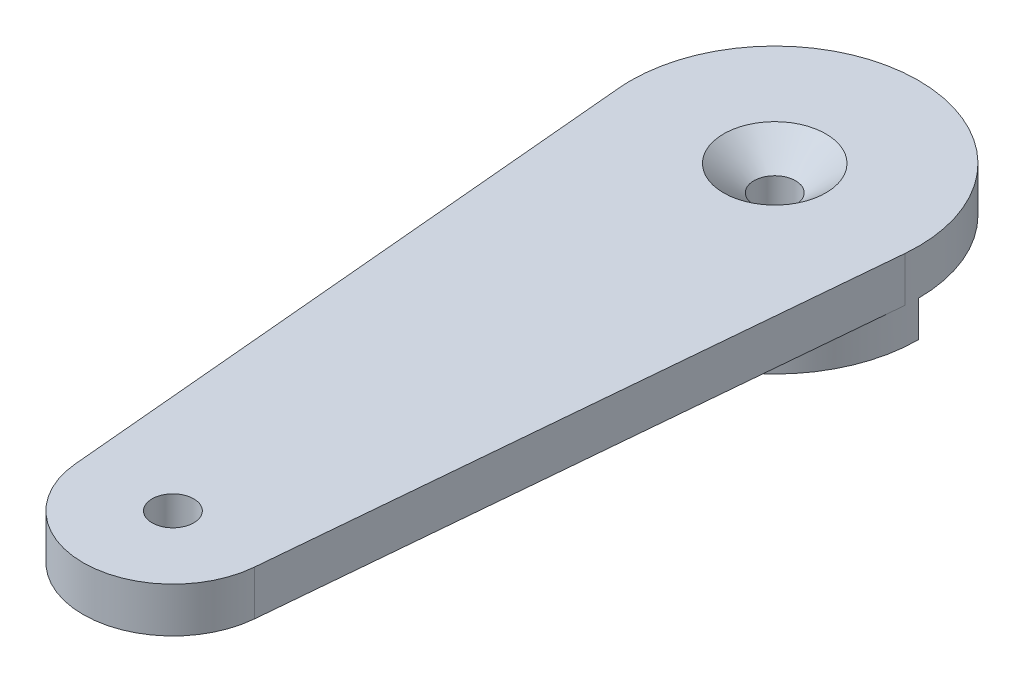
ISO-10303-21;
HEADER;
FILE_DESCRIPTION(('STEP AP214'),'2;1');
FILE_NAME('part.step','',(''),(''),'','','');
FILE_SCHEMA(('AUTOMOTIVE_DESIGN { 1 0 10303 214 1 1 1 1 }'));
ENDSEC;
DATA;
#1=APPLICATION_CONTEXT('core data for automotive mechanical design processes');
#2=APPLICATION_PROTOCOL_DEFINITION('international standard','automotive_design',2000,#1);
#3=PRODUCT_CONTEXT('',#1,'mechanical');
#4=PRODUCT('Part','Part','',(#3));
#5=PRODUCT_RELATED_PRODUCT_CATEGORY('part','',(#4));
#6=PRODUCT_DEFINITION_FORMATION('','',#4);
#7=PRODUCT_DEFINITION_CONTEXT('part definition',#1,'design');
#8=PRODUCT_DEFINITION('design','',#6,#7);
#9=PRODUCT_DEFINITION_SHAPE('','',#8);
#10=(LENGTH_UNIT() NAMED_UNIT(*) SI_UNIT(.MILLI.,.METRE.));
#11=(NAMED_UNIT(*) PLANE_ANGLE_UNIT() SI_UNIT($,.RADIAN.));
#12=(NAMED_UNIT(*) SI_UNIT($,.STERADIAN.) SOLID_ANGLE_UNIT());
#13=UNCERTAINTY_MEASURE_WITH_UNIT(LENGTH_MEASURE(1.E-05),#10,'distance_accuracy_value','');
#14=(GEOMETRIC_REPRESENTATION_CONTEXT(3) GLOBAL_UNCERTAINTY_ASSIGNED_CONTEXT((#13)) GLOBAL_UNIT_ASSIGNED_CONTEXT((#10,
#11,#12)) REPRESENTATION_CONTEXT('',''));
#15=CARTESIAN_POINT('',(0.,0.,0.));
#16=DIRECTION('',(0.,0.,1.));
#17=DIRECTION('',(1.,0.,0.));
#18=AXIS2_PLACEMENT_3D('',#15,#16,#17);
#19=CARTESIAN_POINT('',(0.,3.175,-4.16835077739208E-13));
#20=DIRECTION('',(0.,-1.,0.));
#21=DIRECTION('',(0.,0.,-1.));
#22=AXIS2_PLACEMENT_3D('',#19,#20,#21);
#23=PLANE('',#22);
#24=CARTESIAN_POINT('',(0.,3.175,-4.16835077739208E-13));
#25=DIRECTION('',(0.,1.,0.));
#26=DIRECTION('',(0.,0.,-1.));
#27=AXIS2_PLACEMENT_3D('',#24,#25,#26);
#28=CIRCLE('',#27,10.1600000000001);
#29=CARTESIAN_POINT('',(10.1191784063488,3.175,0.909850746268673));
#30=VERTEX_POINT('',#29);
#31=CARTESIAN_POINT('',(-10.1191784063488,3.175,0.909850746268676));
#32=VERTEX_POINT('',#31);
#33=EDGE_CURVE('E130',#30,#32,#28,.T.);
#34=ORIENTED_EDGE('',*,*,#33,.T.);
#35=DIRECTION('',(0.0895522388059716,0.,0.995982126609127));
#36=VECTOR('',#35,1.);
#37=CARTESIAN_POINT('',(-10.1191784063488,3.175,0.909850746268676));
#38=LINE('',#37,#36);
#39=CARTESIAN_POINT('',(-6.32448650396794,3.175,43.1136567164179));
#40=VERTEX_POINT('',#39);
#41=EDGE_CURVE('E133',#32,#40,#38,.T.);
#42=ORIENTED_EDGE('',*,*,#41,.T.);
#43=CARTESIAN_POINT('',(0.,3.175,42.545));
#44=DIRECTION('',(0.,1.,0.));
#45=DIRECTION('',(0.,0.,1.));
#46=AXIS2_PLACEMENT_3D('',#43,#44,#45);
#47=CIRCLE('',#46,6.35);
#48=CARTESIAN_POINT('',(6.32448650396795,3.175,43.1136567164179));
#49=VERTEX_POINT('',#48);
#50=EDGE_CURVE('E136',#40,#49,#47,.T.);
#51=ORIENTED_EDGE('',*,*,#50,.T.);
#52=DIRECTION('',(0.0895522388059713,0.,-0.995982126609127));
#53=VECTOR('',#52,1.);
#54=CARTESIAN_POINT('',(6.32448650396796,3.175,43.1136567164179));
#55=LINE('',#54,#53);
#56=EDGE_CURVE('E138',#49,#30,#55,.T.);
#57=ORIENTED_EDGE('',*,*,#56,.T.);
#58=EDGE_LOOP('',(#34,#42,#51,#57));
#59=FACE_BOUND('',#58,.T.);
#60=CARTESIAN_POINT('',(0.,3.175,42.545));
#61=DIRECTION('',(0.,1.,0.));
#62=DIRECTION('',(0.,0.,1.));
#63=AXIS2_PLACEMENT_3D('',#60,#61,#62);
#64=CIRCLE('',#63,1.4732);
#65=CARTESIAN_POINT('',(0.,3.175,44.0182));
#66=VERTEX_POINT('',#65);
#67=EDGE_CURVE('E121',#66,#66,#64,.T.);
#68=ORIENTED_EDGE('',*,*,#67,.F.);
#69=EDGE_LOOP('',(#68));
#70=FACE_BOUND('',#69,.T.);
#71=CARTESIAN_POINT('',(0.,3.175,0.));
#72=DIRECTION('',(0.,1.,0.));
#73=DIRECTION('',(0.,0.,1.));
#74=AXIS2_PLACEMENT_3D('',#71,#72,#73);
#75=CIRCLE('',#74,3.6142676);
#76=CARTESIAN_POINT('',(0.,3.175,3.6142676));
#77=VERTEX_POINT('',#76);
#78=EDGE_CURVE('E183',#77,#77,#75,.T.);
#79=ORIENTED_EDGE('',*,*,#78,.F.);
#80=EDGE_LOOP('',(#79));
#81=FACE_BOUND('',#80,.T.);
#82=ADVANCED_FACE('F32',(#59,#70,#81),#23,.F.);
#83=CARTESIAN_POINT('',(0.,0.,-4.16835077739208E-13));
#84=DIRECTION('',(0.,-1.,0.));
#85=DIRECTION('',(0.,0.,-1.));
#86=AXIS2_PLACEMENT_3D('',#83,#84,#85);
#87=PLANE('',#86);
#88=CARTESIAN_POINT('',(0.,0.,-4.52308528141854E-13));
#89=DIRECTION('',(0.,-1.,0.));
#90=DIRECTION('',(0.,0.,-1.));
#91=AXIS2_PLACEMENT_3D('',#88,#89,#90);
#92=CIRCLE('',#91,10.16);
#93=CARTESIAN_POINT('',(10.1191784063488,0.,0.909850746268673));
#94=VERTEX_POINT('',#93);
#95=CARTESIAN_POINT('',(-10.1191784063488,0.,0.909850746268676));
#96=VERTEX_POINT('',#95);
#97=EDGE_CURVE('E11',#94,#96,#92,.T.);
#98=ORIENTED_EDGE('',*,*,#97,.F.);
#99=DIRECTION('',(0.0895522388059713,0.,-0.995982126609127));
#100=VECTOR('',#99,1.);
#101=CARTESIAN_POINT('',(6.32448650396796,0.,43.1136567164179));
#102=LINE('',#101,#100);
#103=CARTESIAN_POINT('',(6.32448650396795,0.,43.1136567164179));
#104=VERTEX_POINT('',#103);
#105=EDGE_CURVE('E134',#104,#94,#102,.T.);
#106=ORIENTED_EDGE('',*,*,#105,.F.);
#107=CARTESIAN_POINT('',(0.,0.,42.545));
#108=DIRECTION('',(0.,1.,0.));
#109=DIRECTION('',(0.,0.,1.));
#110=AXIS2_PLACEMENT_3D('',#107,#108,#109);
#111=CIRCLE('',#110,6.35);
#112=CARTESIAN_POINT('',(-6.32448650396794,0.,43.1136567164179));
#113=VERTEX_POINT('',#112);
#114=EDGE_CURVE('E145',#113,#104,#111,.T.);
#115=ORIENTED_EDGE('',*,*,#114,.F.);
#116=DIRECTION('',(0.0895522388059716,0.,0.995982126609127));
#117=VECTOR('',#116,1.);
#118=CARTESIAN_POINT('',(-10.1191784063488,0.,0.909850746268676));
#119=LINE('',#118,#117);
#120=EDGE_CURVE('E143',#96,#113,#119,.T.);
#121=ORIENTED_EDGE('',*,*,#120,.F.);
#122=EDGE_LOOP('',(#98,#106,#115,#121));
#123=FACE_BOUND('',#122,.T.);
#124=CARTESIAN_POINT('',(0.,0.,42.545));
#125=DIRECTION('',(0.,1.,0.));
#126=DIRECTION('',(0.,0.,1.));
#127=AXIS2_PLACEMENT_3D('',#124,#125,#126);
#128=CIRCLE('',#127,1.4732);
#129=CARTESIAN_POINT('',(0.,0.,44.0182));
#130=VERTEX_POINT('',#129);
#131=EDGE_CURVE('E118',#130,#130,#128,.T.);
#132=ORIENTED_EDGE('',*,*,#131,.T.);
#133=EDGE_LOOP('',(#132));
#134=FACE_BOUND('',#133,.T.);
#135=ADVANCED_FACE('F168',(#123,#134),#87,.T.);
#136=DIRECTION('',(1.,0.,0.));
#137=VECTOR('',#136,1.);
#138=CARTESIAN_POINT('',(-10.16,0.,-4.87781978544501E-13));
#139=LINE('',#138,#137);
#140=CARTESIAN_POINT('',(-10.1600000000001,0.,-4.86537737396568E-13));
#141=VERTEX_POINT('',#140);
#142=CARTESIAN_POINT('',(-7.61999999999999,0.,-4.16835077739208E-13));
#143=VERTEX_POINT('',#142);
#144=EDGE_CURVE('E115',#141,#143,#139,.T.);
#145=ORIENTED_EDGE('',*,*,#144,.F.);
#146=CARTESIAN_POINT('',(0.,0.,-4.16835077739208E-13));
#147=DIRECTION('',(0.,1.,0.));
#148=DIRECTION('',(0.,0.,-1.));
#149=AXIS2_PLACEMENT_3D('',#146,#147,#148);
#150=CIRCLE('',#149,10.1600000000001);
#151=CARTESIAN_POINT('',(10.16,0.,-4.16835077739208E-13));
#152=VERTEX_POINT('',#151);
#153=EDGE_CURVE('E128',#152,#141,#150,.T.);
#154=ORIENTED_EDGE('',*,*,#153,.F.);
#155=DIRECTION('',(1.,0.,0.));
#156=VECTOR('',#155,1.);
#157=CARTESIAN_POINT('',(7.61999999999999,0.,-4.16835077739208E-13));
#158=LINE('',#157,#156);
#159=CARTESIAN_POINT('',(7.61999999999999,0.,-4.16835077739208E-13));
#160=VERTEX_POINT('',#159);
#161=EDGE_CURVE('E53',#160,#152,#158,.T.);
#162=ORIENTED_EDGE('',*,*,#161,.F.);
#163=CARTESIAN_POINT('',(0.,0.,-4.16835077739208E-13));
#164=DIRECTION('',(0.,-1.,0.));
#165=DIRECTION('',(0.,0.,-1.));
#166=AXIS2_PLACEMENT_3D('',#163,#164,#165);
#167=CIRCLE('',#166,7.61999999999999);
#168=EDGE_CURVE('E48',#143,#160,#167,.T.);
#169=ORIENTED_EDGE('',*,*,#168,.F.);
#170=EDGE_LOOP('',(#145,#154,#162,#169));
#171=FACE_BOUND('',#170,.T.);
#172=ADVANCED_FACE('F204',(#171),#87,.T.);
#173=CARTESIAN_POINT('',(0.,3.175,-4.16835077739208E-13));
#174=DIRECTION('',(0.,-1.,0.));
#175=DIRECTION('',(0.,0.,-1.));
#176=AXIS2_PLACEMENT_3D('',#173,#174,#175);
#177=CYLINDRICAL_SURFACE('',#176,10.1600000000001);
#178=DIRECTION('',(0.,1.,0.));
#179=VECTOR('',#178,1.);
#180=CARTESIAN_POINT('',(10.16,-2.54,-4.16835077739208E-13));
#181=LINE('',#180,#179);
#182=CARTESIAN_POINT('',(10.16,-2.54,-4.16835077739208E-13));
#183=VERTEX_POINT('',#182);
#184=EDGE_CURVE('E102',#183,#152,#181,.T.);
#185=ORIENTED_EDGE('',*,*,#184,.T.);
#186=ORIENTED_EDGE('',*,*,#153,.T.);
#187=DIRECTION('',(0.,1.,0.));
#188=VECTOR('',#187,1.);
#189=CARTESIAN_POINT('',(-10.16,-2.54,-4.86537737396567E-13));
#190=LINE('',#189,#188);
#191=CARTESIAN_POINT('',(-10.16,-2.54,-4.86537737396567E-13));
#192=VERTEX_POINT('',#191);
#193=EDGE_CURVE('E123',#192,#141,#190,.T.);
#194=ORIENTED_EDGE('',*,*,#193,.F.);
#195=CARTESIAN_POINT('',(0.,-2.54,-4.52308528141854E-13));
#196=DIRECTION('',(0.,-1.,0.));
#197=DIRECTION('',(0.,0.,-1.));
#198=AXIS2_PLACEMENT_3D('',#195,#196,#197);
#199=CIRCLE('',#198,10.16);
#200=EDGE_CURVE('E105',#183,#192,#199,.T.);
#201=ORIENTED_EDGE('',*,*,#200,.F.);
#202=EDGE_LOOP('',(#185,#186,#194,#201));
#203=FACE_BOUND('',#202,.T.);
#204=DIRECTION('',(0.,-1.,0.));
#205=VECTOR('',#204,1.);
#206=CARTESIAN_POINT('',(10.1191784063488,3.175,0.909850746268673));
#207=LINE('',#206,#205);
#208=EDGE_CURVE('E140',#30,#94,#207,.T.);
#209=ORIENTED_EDGE('',*,*,#208,.T.);
#210=ORIENTED_EDGE('',*,*,#97,.T.);
#211=DIRECTION('',(0.,-1.,0.));
#212=VECTOR('',#211,1.);
#213=CARTESIAN_POINT('',(-10.1191784063488,3.175,0.909850746268676));
#214=LINE('',#213,#212);
#215=EDGE_CURVE('E36',#32,#96,#214,.T.);
#216=ORIENTED_EDGE('',*,*,#215,.F.);
#217=ORIENTED_EDGE('',*,*,#33,.F.);
#218=EDGE_LOOP('',(#209,#210,#216,#217));
#219=FACE_BOUND('',#218,.T.);
#220=ADVANCED_FACE('F34',(#203,#219),#177,.T.);
#221=CARTESIAN_POINT('',(-10.1191784063488,3.175,0.909850746268676));
#222=DIRECTION('',(0.995982126609127,0.,-0.0895522388059716));
#223=DIRECTION('',(-0.0895522388059716,0.,-0.995982126609127));
#224=AXIS2_PLACEMENT_3D('',#221,#222,#223);
#225=PLANE('',#224);
#226=ORIENTED_EDGE('',*,*,#120,.T.);
#227=DIRECTION('',(0.,-1.,0.));
#228=VECTOR('',#227,1.);
#229=CARTESIAN_POINT('',(-6.32448650396794,3.175,43.1136567164179));
#230=LINE('',#229,#228);
#231=EDGE_CURVE('E153',#40,#113,#230,.T.);
#232=ORIENTED_EDGE('',*,*,#231,.F.);
#233=ORIENTED_EDGE('',*,*,#41,.F.);
#234=ORIENTED_EDGE('',*,*,#215,.T.);
#235=EDGE_LOOP('',(#226,#232,#233,#234));
#236=FACE_BOUND('',#235,.T.);
#237=ADVANCED_FACE('F162',(#236),#225,.F.);
#238=CARTESIAN_POINT('',(0.,3.175,42.545));
#239=DIRECTION('',(0.,-1.,0.));
#240=DIRECTION('',(0.,0.,-1.));
#241=AXIS2_PLACEMENT_3D('',#238,#239,#240);
#242=CYLINDRICAL_SURFACE('',#241,6.35);
#243=ORIENTED_EDGE('',*,*,#114,.T.);
#244=DIRECTION('',(0.,-1.,0.));
#245=VECTOR('',#244,1.);
#246=CARTESIAN_POINT('',(6.32448650396795,3.175,43.1136567164179));
#247=LINE('',#246,#245);
#248=EDGE_CURVE('E151',#49,#104,#247,.T.);
#249=ORIENTED_EDGE('',*,*,#248,.F.);
#250=ORIENTED_EDGE('',*,*,#50,.F.);
#251=ORIENTED_EDGE('',*,*,#231,.T.);
#252=EDGE_LOOP('',(#243,#249,#250,#251));
#253=FACE_BOUND('',#252,.T.);
#254=ADVANCED_FACE('F174',(#253),#242,.T.);
#255=CARTESIAN_POINT('',(6.32448650396796,3.175,43.1136567164179));
#256=DIRECTION('',(-0.995982126609127,0.,-0.0895522388059713));
#257=DIRECTION('',(-0.0895522388059713,0.,0.995982126609127));
#258=AXIS2_PLACEMENT_3D('',#255,#256,#257);
#259=PLANE('',#258);
#260=ORIENTED_EDGE('',*,*,#105,.T.);
#261=ORIENTED_EDGE('',*,*,#208,.F.);
#262=ORIENTED_EDGE('',*,*,#56,.F.);
#263=ORIENTED_EDGE('',*,*,#248,.T.);
#264=EDGE_LOOP('',(#260,#261,#262,#263));
#265=FACE_BOUND('',#264,.T.);
#266=ADVANCED_FACE('F171',(#265),#259,.F.);
#267=CARTESIAN_POINT('',(0.,3.175,42.545));
#268=DIRECTION('',(0.,-1.,0.));
#269=DIRECTION('',(0.,0.,-1.));
#270=AXIS2_PLACEMENT_3D('',#267,#268,#269);
#271=CYLINDRICAL_SURFACE('',#270,1.4732);
#272=ORIENTED_EDGE('',*,*,#67,.T.);
#273=EDGE_LOOP('',(#272));
#274=FACE_BOUND('',#273,.T.);
#275=ORIENTED_EDGE('',*,*,#131,.F.);
#276=EDGE_LOOP('',(#275));
#277=FACE_BOUND('',#276,.T.);
#278=ADVANCED_FACE('F215',(#274,#277),#271,.F.);
#279=CARTESIAN_POINT('',(0.,-2.54,-4.16835077739208E-13));
#280=DIRECTION('',(0.,1.,0.));
#281=DIRECTION('',(0.,0.,1.));
#282=AXIS2_PLACEMENT_3D('',#279,#280,#281);
#283=CYLINDRICAL_SURFACE('',#282,7.61999999999999);
#284=ORIENTED_EDGE('',*,*,#168,.T.);
#285=DIRECTION('',(0.,1.,0.));
#286=VECTOR('',#285,1.);
#287=CARTESIAN_POINT('',(7.61999999999999,-2.54,-4.16835077739208E-13));
#288=LINE('',#287,#286);
#289=CARTESIAN_POINT('',(7.61999999999999,-2.54,-4.16835077739208E-13));
#290=VERTEX_POINT('',#289);
#291=EDGE_CURVE('E100',#290,#160,#288,.T.);
#292=ORIENTED_EDGE('',*,*,#291,.F.);
#293=CARTESIAN_POINT('',(0.,-2.54,-4.16835077739208E-13));
#294=DIRECTION('',(0.,-1.,0.));
#295=DIRECTION('',(0.,0.,-1.));
#296=AXIS2_PLACEMENT_3D('',#293,#294,#295);
#297=CIRCLE('',#296,7.61999999999999);
#298=CARTESIAN_POINT('',(-7.61999999999999,-2.54,-4.16835077739208E-13));
#299=VERTEX_POINT('',#298);
#300=EDGE_CURVE('E106',#299,#290,#297,.T.);
#301=ORIENTED_EDGE('',*,*,#300,.F.);
#302=DIRECTION('',(0.,1.,0.));
#303=VECTOR('',#302,1.);
#304=CARTESIAN_POINT('',(-7.61999999999999,-2.54,-4.16835077739208E-13));
#305=LINE('',#304,#303);
#306=EDGE_CURVE('E195',#299,#143,#305,.T.);
#307=ORIENTED_EDGE('',*,*,#306,.T.);
#308=EDGE_LOOP('',(#284,#292,#301,#307));
#309=FACE_BOUND('',#308,.T.);
#310=ADVANCED_FACE('F117',(#309),#283,.T.);
#311=CARTESIAN_POINT('',(7.61999999999999,-2.54,-4.16835077739208E-13));
#312=DIRECTION('',(0.,0.,1.));
#313=DIRECTION('',(1.,0.,0.));
#314=AXIS2_PLACEMENT_3D('',#311,#312,#313);
#315=PLANE('',#314);
#316=ORIENTED_EDGE('',*,*,#161,.T.);
#317=ORIENTED_EDGE('',*,*,#184,.F.);
#318=DIRECTION('',(1.,0.,0.));
#319=VECTOR('',#318,1.);
#320=CARTESIAN_POINT('',(7.61999999999999,-2.54,-4.16835077739208E-13));
#321=LINE('',#320,#319);
#322=EDGE_CURVE('E96',#290,#183,#321,.T.);
#323=ORIENTED_EDGE('',*,*,#322,.F.);
#324=ORIENTED_EDGE('',*,*,#291,.T.);
#325=EDGE_LOOP('',(#316,#317,#323,#324));
#326=FACE_BOUND('',#325,.T.);
#327=ADVANCED_FACE('F98',(#326),#315,.F.);
#328=CARTESIAN_POINT('',(-10.16,-2.54,-4.87781978544501E-13));
#329=DIRECTION('',(0.,0.,1.));
#330=DIRECTION('',(1.,0.,0.));
#331=AXIS2_PLACEMENT_3D('',#328,#329,#330);
#332=PLANE('',#331);
#333=ORIENTED_EDGE('',*,*,#144,.T.);
#334=ORIENTED_EDGE('',*,*,#306,.F.);
#335=DIRECTION('',(1.,0.,0.));
#336=VECTOR('',#335,1.);
#337=CARTESIAN_POINT('',(-10.16,-2.54,-4.87781978544501E-13));
#338=LINE('',#337,#336);
#339=EDGE_CURVE('E111',#192,#299,#338,.T.);
#340=ORIENTED_EDGE('',*,*,#339,.F.);
#341=ORIENTED_EDGE('',*,*,#193,.T.);
#342=EDGE_LOOP('',(#333,#334,#340,#341));
#343=FACE_BOUND('',#342,.T.);
#344=ADVANCED_FACE('F202',(#343),#332,.F.);
#345=CARTESIAN_POINT('',(0.,-2.54,-4.16835077739208E-13));
#346=DIRECTION('',(0.,-1.,0.));
#347=DIRECTION('',(0.,0.,-1.));
#348=AXIS2_PLACEMENT_3D('',#345,#346,#347);
#349=PLANE('',#348);
#350=CARTESIAN_POINT('',(0.,-2.54,0.));
#351=DIRECTION('',(0.,1.,0.));
#352=DIRECTION('',(0.,0.,1.));
#353=AXIS2_PLACEMENT_3D('',#350,#351,#352);
#354=CIRCLE('',#353,1.4732);
#355=CARTESIAN_POINT('',(0.,-2.54,1.4732));
#356=VERTEX_POINT('',#355);
#357=EDGE_CURVE('E188',#356,#356,#354,.T.);
#358=ORIENTED_EDGE('',*,*,#357,.T.);
#359=EDGE_LOOP('',(#358));
#360=FACE_BOUND('',#359,.T.);
#361=ORIENTED_EDGE('',*,*,#300,.T.);
#362=ORIENTED_EDGE('',*,*,#322,.T.);
#363=ORIENTED_EDGE('',*,*,#200,.T.);
#364=ORIENTED_EDGE('',*,*,#339,.T.);
#365=EDGE_LOOP('',(#361,#362,#363,#364));
#366=FACE_BOUND('',#365,.T.);
#367=ADVANCED_FACE('F109',(#360,#366),#349,.T.);
#368=CARTESIAN_POINT('',(0.,3.175,0.));
#369=DIRECTION('',(0.,1.,0.));
#370=DIRECTION('',(0.,0.,1.));
#371=AXIS2_PLACEMENT_3D('',#368,#369,#370);
#372=CYLINDRICAL_SURFACE('',#371,1.4732);
#373=ORIENTED_EDGE('',*,*,#357,.F.);
#374=EDGE_LOOP('',(#373));
#375=FACE_BOUND('',#374,.T.);
#376=CARTESIAN_POINT('',(0.,1.37843096651438,0.));
#377=DIRECTION('',(0.,1.,0.));
#378=DIRECTION('',(0.,0.,1.));
#379=AXIS2_PLACEMENT_3D('',#376,#377,#378);
#380=CIRCLE('',#379,1.4732);
#381=CARTESIAN_POINT('',(0.,1.37843096651438,1.4732));
#382=VERTEX_POINT('',#381);
#383=EDGE_CURVE('E185',#382,#382,#380,.T.);
#384=ORIENTED_EDGE('',*,*,#383,.T.);
#385=EDGE_LOOP('',(#384));
#386=FACE_BOUND('',#385,.T.);
#387=ADVANCED_FACE('F262',(#375,#386),#372,.F.);
#388=CARTESIAN_POINT('',(0.,3.175,0.));
#389=DIRECTION('',(0.,1.,0.));
#390=DIRECTION('',(0.,0.,1.));
#391=AXIS2_PLACEMENT_3D('',#388,#389,#390);
#392=CONICAL_SURFACE('',#391,3.6142676,0.872664625997165);
#393=ORIENTED_EDGE('',*,*,#383,.F.);
#394=EDGE_LOOP('',(#393));
#395=FACE_BOUND('',#394,.T.);
#396=ORIENTED_EDGE('',*,*,#78,.T.);
#397=EDGE_LOOP('',(#396));
#398=FACE_BOUND('',#397,.T.);
#399=ADVANCED_FACE('F270',(#395,#398),#392,.F.);
#400=CLOSED_SHELL('',(#82,#135,#172,#220,#237,#254,#266,#278,#310,#327,#344,#367,#387,#399));
#401=MANIFOLD_SOLID_BREP('B2',#400);
#402=ADVANCED_BREP_SHAPE_REPRESENTATION('',(#18,#401),#14);
#403=SHAPE_DEFINITION_REPRESENTATION(#9,#402);
ENDSEC;
END-ISO-10303-21;
